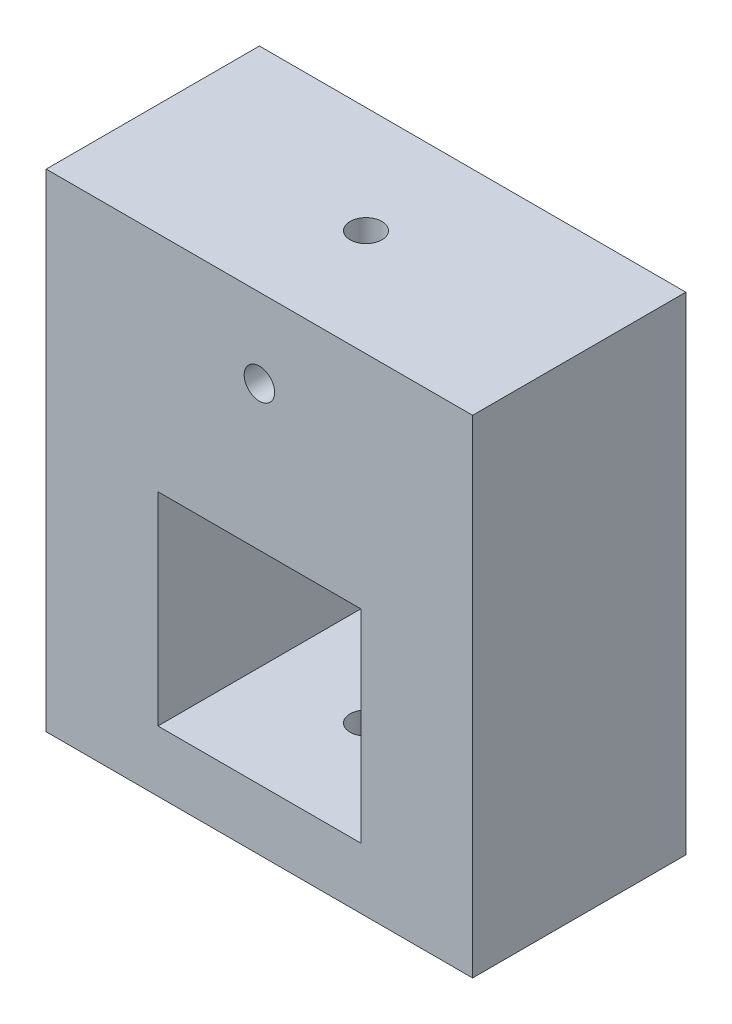
ISO-10303-21;
HEADER;
FILE_DESCRIPTION(('STEP AP214'),'2;1');
FILE_NAME('part.step','',(''),(''),'','','');
FILE_SCHEMA(('AUTOMOTIVE_DESIGN { 1 0 10303 214 1 1 1 1 }'));
ENDSEC;
DATA;
#1=APPLICATION_CONTEXT('core data for automotive mechanical design processes');
#2=APPLICATION_PROTOCOL_DEFINITION('international standard','automotive_design',2000,#1);
#3=PRODUCT_CONTEXT('',#1,'mechanical');
#4=PRODUCT('Part','Part','',(#3));
#5=PRODUCT_RELATED_PRODUCT_CATEGORY('part','',(#4));
#6=PRODUCT_DEFINITION_FORMATION('','',#4);
#7=PRODUCT_DEFINITION_CONTEXT('part definition',#1,'design');
#8=PRODUCT_DEFINITION('design','',#6,#7);
#9=PRODUCT_DEFINITION_SHAPE('','',#8);
#10=(LENGTH_UNIT() NAMED_UNIT(*) SI_UNIT(.MILLI.,.METRE.));
#11=(NAMED_UNIT(*) PLANE_ANGLE_UNIT() SI_UNIT($,.RADIAN.));
#12=(NAMED_UNIT(*) SI_UNIT($,.STERADIAN.) SOLID_ANGLE_UNIT());
#13=UNCERTAINTY_MEASURE_WITH_UNIT(LENGTH_MEASURE(1.E-05),#10,'distance_accuracy_value','');
#14=(GEOMETRIC_REPRESENTATION_CONTEXT(3) GLOBAL_UNCERTAINTY_ASSIGNED_CONTEXT((#13)) GLOBAL_UNIT_ASSIGNED_CONTEXT((#10,
#11,#12)) REPRESENTATION_CONTEXT('',''));
#15=CARTESIAN_POINT('',(0.,0.,0.));
#16=DIRECTION('',(0.,0.,1.));
#17=DIRECTION('',(1.,0.,0.));
#18=AXIS2_PLACEMENT_3D('',#15,#16,#17);
#19=CARTESIAN_POINT('',(0.,101.6,0.));
#20=DIRECTION('',(0.,-1.,0.));
#21=DIRECTION('',(0.,0.,-1.));
#22=AXIS2_PLACEMENT_3D('',#19,#20,#21);
#23=CYLINDRICAL_SURFACE('',#22,3.32310507927727);
#24=CARTESIAN_POINT('',(0.,88.265,-3.32310507927725));
#25=CARTESIAN_POINT('',(-0.0719628894680428,88.2649995929097,-3.3231046721935));
#26=CARTESIAN_POINT('',(-0.143948059310517,88.2625478466654,-3.32076197001386));
#27=CARTESIAN_POINT('',(-0.287320125691089,88.2527901679541,-3.31144107507179));
#28=CARTESIAN_POINT('',(-0.358706582399328,88.2454809377386,-3.30445973313507));
#29=CARTESIAN_POINT('',(-0.500404983924367,88.2261347004359,-3.28599069256951));
#30=CARTESIAN_POINT('',(-0.570714314526168,88.2140876507875,-3.27449342177729));
#31=CARTESIAN_POINT('',(-0.709583781087099,88.1855053259842,-3.24723535736837));
#32=CARTESIAN_POINT('',(-0.778143063548392,88.1689679049612,-3.23147252532856));
#33=CARTESIAN_POINT('',(-0.979445856888055,88.1133326692021,-3.17849219988499));
#34=CARTESIAN_POINT('',(-1.10901819741605,88.0680401974484,-3.13541841190377));
#35=CARTESIAN_POINT('',(-1.35688704613617,87.9636101088531,-3.03640634175811));
#36=CARTESIAN_POINT('',(-1.4751854587132,87.9044748361826,-2.98047023775558));
#37=CARTESIAN_POINT('',(-1.74548646016447,87.7484180465737,-2.8334855720088));
#38=CARTESIAN_POINT('',(-1.89154612476528,87.6459239361564,-2.73742277708625));
#39=CARTESIAN_POINT('',(-2.15946798730409,87.4240439082945,-2.53148553149346));
#40=CARTESIAN_POINT('',(-2.28125328075335,87.3046062948107,-2.42156893062753));
#41=CARTESIAN_POINT('',(-2.46390433434089,87.0954897669931,-2.23229787553111));
#42=CARTESIAN_POINT('',(-2.5314294622677,87.009440653002,-2.15520780705837));
#43=CARTESIAN_POINT('',(-2.65659697467479,86.8321002403306,-1.99888549427369));
#44=CARTESIAN_POINT('',(-2.71423238513474,86.7408053024725,-1.91965178352128));
#45=CARTESIAN_POINT('',(-2.81975894618337,86.5532659809747,-1.76097987978065));
#46=CARTESIAN_POINT('',(-2.86766665087914,86.4570303608901,-1.6815422711334));
#47=CARTESIAN_POINT('',(-2.9539914147846,86.2588713139742,-1.52476510133464));
#48=CARTESIAN_POINT('',(-2.99241916138363,86.1569544524383,-1.44742326588901));
#49=CARTESIAN_POINT('',(-3.04913815456089,85.9783704528915,-1.32247198181113));
#50=CARTESIAN_POINT('',(-3.0699717485766,85.9037417014365,-1.2731125240853));
#51=CARTESIAN_POINT('',(-3.10675253142721,85.7495461701801,-1.18049435164098));
#52=CARTESIAN_POINT('',(-3.1227044831238,85.6699842952271,-1.13722971279422));
#53=CARTESIAN_POINT('',(-3.14495562109349,85.5296220077705,-1.07380563314068));
#54=CARTESIAN_POINT('',(-3.15271504122451,85.4704648538344,-1.05061990503111));
#55=CARTESIAN_POINT('',(-3.1649882469882,85.3491641701777,-1.01305027303107));
#56=CARTESIAN_POINT('',(-3.16951333276403,85.2870318552562,-0.998635750742641));
#57=CARTESIAN_POINT('',(-3.17487016728978,85.1599851443049,-0.981492533985096));
#58=CARTESIAN_POINT('',(-3.17564861209525,85.0950437854406,-0.978932514299723));
#59=CARTESIAN_POINT('',(-3.17323716638988,84.9660049020759,-0.986712118036445));
#60=CARTESIAN_POINT('',(-3.17004226848449,84.9019085454446,-0.99706801875974));
#61=CARTESIAN_POINT('',(-3.15892206039322,84.7614129770987,-1.03180492970362));
#62=CARTESIAN_POINT('',(-3.15003250196133,84.6858293405592,-1.05899219410396));
#63=CARTESIAN_POINT('',(-3.12778164273254,84.5394194202577,-1.12301584318632));
#64=CARTESIAN_POINT('',(-3.11439714521725,84.4686201516173,-1.15990206174058));
#65=CARTESIAN_POINT('',(-3.07770634176028,84.3038509484906,-1.25468563239307));
#66=CARTESIAN_POINT('',(-3.05256950083859,84.2117881826296,-1.31512394998334));
#67=CARTESIAN_POINT('',(-2.99538141279573,84.0330659094562,-1.44066983774483));
#68=CARTESIAN_POINT('',(-2.96331749829891,83.9464166810568,-1.50578581425682));
#69=CARTESIAN_POINT('',(-2.89233190024716,83.7771895957228,-1.63801437676553));
#70=CARTESIAN_POINT('',(-2.85339353334248,83.6946222836129,-1.70513148218597));
#71=CARTESIAN_POINT('',(-2.76868848648852,83.5333116975272,-1.83948460802266));
#72=CARTESIAN_POINT('',(-2.72292718847824,83.4545654737851,-1.90672049380565));
#73=CARTESIAN_POINT('',(-2.62220880369955,83.2973101394481,-2.04317111270075));
#74=CARTESIAN_POINT('',(-2.56693548497014,83.2189642074982,-2.11234258539904));
#75=CARTESIAN_POINT('',(-2.44852496134113,83.0664682272024,-2.24853645453567));
#76=CARTESIAN_POINT('',(-2.38538511227061,82.99231960194,-2.31555811879021));
#77=CARTESIAN_POINT('',(-2.18413258360923,82.7772925094163,-2.51147255246812));
#78=CARTESIAN_POINT('',(-2.03375554028129,82.6431451222397,-2.63582315215429));
#79=CARTESIAN_POINT('',(-1.75209618579467,82.4384216520607,-2.82708877028671));
#80=CARTESIAN_POINT('',(-1.62960045613412,82.3610984662687,-2.899790192172));
#81=CARTESIAN_POINT('',(-1.36932822762399,82.2216766057466,-3.03135947595703));
#82=CARTESIAN_POINT('',(-1.23156767353863,82.1595622584684,-3.09024157590399));
#83=CARTESIAN_POINT('',(-0.964365114052177,82.0621744831952,-3.18275636379304));
#84=CARTESIAN_POINT('',(-0.836736651144741,82.0242821398419,-3.21884269574408));
#85=CARTESIAN_POINT('',(-0.574492110422607,81.9645197991814,-3.27581225321721));
#86=CARTESIAN_POINT('',(-0.43988042230729,81.9426398639908,-3.29670490843754));
#87=CARTESIAN_POINT('',(-0.166877373579198,81.9164151783968,-3.32175069901273));
#88=CARTESIAN_POINT('',(-0.0284739370676149,81.9121351882427,-3.32584201256186));
#89=CARTESIAN_POINT('',(0.247134832522216,81.9216306990446,-3.31677019085915));
#90=CARTESIAN_POINT('',(0.384340116160246,81.9354069415567,-3.30360634695081));
#91=CARTESIAN_POINT('',(0.645455680768369,81.9786469829875,-3.26234289740734));
#92=CARTESIAN_POINT('',(0.769675134528781,82.0071520803762,-3.2351562110502));
#93=CARTESIAN_POINT('',(1.01064402563281,82.0775248185352,-3.16816895479981));
#94=CARTESIAN_POINT('',(1.1273907257246,82.1193973225072,-3.12836379421114));
#95=CARTESIAN_POINT('',(1.39291452502013,82.2320052532176,-3.02160546143124));
#96=CARTESIAN_POINT('',(1.53774407146582,82.307694360523,-2.9500494520659));
#97=CARTESIAN_POINT('',(1.80859987613172,82.4755952875136,-2.79225776273733));
#98=CARTESIAN_POINT('',(1.93458706477745,82.5678405889483,-2.70599235381182));
#99=CARTESIAN_POINT('',(2.20922415491393,82.8002672695885,-2.49051521227594));
#100=CARTESIAN_POINT('',(2.34994365477591,82.9458148179591,-2.35695613457068));
#101=CARTESIAN_POINT('',(2.53605940239768,83.1771883224825,-2.14944303858524));
#102=CARTESIAN_POINT('',(2.59398835425322,83.2565846720653,-2.07899313221417));
#103=CARTESIAN_POINT('',(2.7018048384047,83.4195496799966,-1.93681113895068));
#104=CARTESIAN_POINT('',(2.75169525273491,83.5031168288627,-1.86507952187899));
#105=CARTESIAN_POINT('',(2.85946112791458,83.7039085527315,-1.69692146100411));
#106=CARTESIAN_POINT('',(2.91419413165943,83.82283540787,-1.6004748458269));
#107=CARTESIAN_POINT('',(2.98572104470139,84.00813087628,-1.45989061647062));
#108=CARTESIAN_POINT('',(3.00778611389592,84.070987157153,-1.41374989864057));
#109=CARTESIAN_POINT('',(3.04833868364338,84.1996013037859,-1.32403422858988));
#110=CARTESIAN_POINT('',(3.0668285087288,84.2653572498675,-1.28045762216021));
#111=CARTESIAN_POINT('',(3.09840320589347,84.3939637903436,-1.20188931423008));
#112=CARTESIAN_POINT('',(3.11184063275491,84.4564650803155,-1.16647479350597));
#113=CARTESIAN_POINT('',(3.13531039407728,84.5852888761238,-1.10183151896138));
#114=CARTESIAN_POINT('',(3.14534510891551,84.6516086725624,-1.07259844630167));
#115=CARTESIAN_POINT('',(3.15982647303946,84.7750669653401,-1.02905358981892));
#116=CARTESIAN_POINT('',(3.16498244433069,84.8314617684853,-1.01294118334985));
#117=CARTESIAN_POINT('',(3.17225996882404,84.9462215366478,-0.989923766705363));
#118=CARTESIAN_POINT('',(3.17439104541016,85.0045797235832,-0.982989864187884));
#119=CARTESIAN_POINT('',(3.17538379562064,85.1219458093254,-0.979780873097124));
#120=CARTESIAN_POINT('',(3.17422826815657,85.1809555103722,-0.983561862641266));
#121=CARTESIAN_POINT('',(3.16875917476272,85.2973905998246,-1.00103374556159));
#122=CARTESIAN_POINT('',(3.16443720419124,85.3548113489394,-1.01475101154825));
#123=CARTESIAN_POINT('',(3.14989233108371,85.4980438149906,-1.05923880867261));
#124=CARTESIAN_POINT('',(3.13772673770057,85.5819589925022,-1.0952468944224));
#125=CARTESIAN_POINT('',(3.10801817688304,85.7439776672191,-1.17692829422889));
#126=CARTESIAN_POINT('',(3.09045079877255,85.8220527398335,-1.22264518617822));
#127=CARTESIAN_POINT('',(3.04742103247679,85.9855760526906,-1.3266108366896));
#128=CARTESIAN_POINT('',(3.02115353433142,86.0702673431208,-1.3857012667116));
#129=CARTESIAN_POINT('',(2.96253775868488,86.2352769397539,-1.50697016813464));
#130=CARTESIAN_POINT('',(2.93018334336836,86.3155907254908,-1.56915170951791));
#131=CARTESIAN_POINT('',(2.85940368149672,86.4727003000036,-1.69470974106039));
#132=CARTESIAN_POINT('',(2.82097114245325,86.5494917180381,-1.7580875850484));
#133=CARTESIAN_POINT('',(2.7380037262583,86.6997587462441,-1.88470089047189));
#134=CARTESIAN_POINT('',(2.69347102483194,86.7732355262714,-1.94793639453826));
#135=CARTESIAN_POINT('',(2.58955501420356,86.9298844209112,-2.08467359970878));
#136=CARTESIAN_POINT('',(2.52894121121664,87.0124245324518,-2.1579769845902));
#137=CARTESIAN_POINT('',(2.39873742263109,87.1726326827643,-2.30185404160141));
#138=CARTESIAN_POINT('',(2.32914409836394,87.2502988933298,-2.37242668566601));
#139=CARTESIAN_POINT('',(2.10675011584008,87.4746153492537,-2.57781725208352));
#140=CARTESIAN_POINT('',(1.9398514416458,87.6133322688888,-2.70697461102003));
#141=CARTESIAN_POINT('',(1.63850596912244,87.8130853422638,-2.89429268161168));
#142=CARTESIAN_POINT('',(1.51553003794063,87.8836960318788,-2.960866618203));
#143=CARTESIAN_POINT('',(1.25563203191797,88.0097233390715,-3.08005801311208));
#144=CARTESIAN_POINT('',(1.11872119350128,88.0651520675741,-3.13268659479311));
#145=CARTESIAN_POINT('',(0.852714631192001,88.1511003609329,-3.21443464060099));
#146=CARTESIAN_POINT('',(0.725062442758907,88.1839736244598,-3.24576975534904));
#147=CARTESIAN_POINT('',(0.464084447097616,88.233688613161,-3.29319344042971));
#148=CARTESIAN_POINT('',(0.330774716351617,88.2505729528498,-3.30932253812058));
#149=CARTESIAN_POINT('',(0.163954930341117,88.2609350666816,-3.31922155029249));
#150=CARTESIAN_POINT('',(0.131205489399635,88.2624578234865,-3.3206762909909));
#151=CARTESIAN_POINT('',(0.065638915496142,88.2644904415946,-3.32261820430773));
#152=CARTESIAN_POINT('',(0.032821775139713,88.265000185671,-3.32310526494533));
#153=CARTESIAN_POINT('',(0.,88.265,-3.32310507927725));
#154=B_SPLINE_CURVE_WITH_KNOTS('',3,(#24,#25,#26,#27,#28,#29,#30,#31,#32,#33,#34,#35,#36,#37,
#38,#39,#40,#41,#42,#43,#44,#45,#46,#47,#48,#49,#50,#51,#52,#53,#54,#55,#56,#57,#58,#59,#60,#61,
#62,#63,#64,#65,#66,#67,#68,#69,#70,#71,#72,#73,#74,#75,#76,#77,#78,#79,#80,#81,#82,#83,#84,#85,
#86,#87,#88,#89,#90,#91,#92,#93,#94,#95,#96,#97,#98,#99,#100,#101,#102,#103,#104,#105,#106,#107,
#108,#109,#110,#111,#112,#113,#114,#115,#116,#117,#118,#119,#120,#121,#122,#123,#124,#125,#126,
#127,#128,#129,#130,#131,#132,#133,#134,#135,#136,#137,#138,#139,#140,#141,#142,#143,#144,#145,
#146,#147,#148,#149,#150,#151,#152,#153),.UNSPECIFIED.,.T.,.F.,(4,2,2,2,2,2,2,2,2,2,2,2,2,2,2,2,
2,2,2,2,2,2,2,2,2,2,2,2,2,2,2,2,2,2,2,2,2,2,2,2,2,2,2,2,2,2,2,2,2,2,2,2,2,2,2,2,2,2,2,2,2,2,2,2,
4),(0.,0.215847880822609,0.431842450787801,0.648297344778737,0.864855861294421,1.29434103632481,
1.72375353391482,2.32837864105842,2.93488985561014,3.33588723723923,3.73716624192263,
4.13775653945137,4.53789313953443,4.81323612427386,5.08830960284973,5.27981694740716,
5.47065188736831,5.66419399308128,5.85798025707112,6.0990649805467,6.34141347659721,
6.67958664267783,7.01838353314657,7.35801423188328,7.6973784329951,8.05168852590495,
8.40611803573895,9.11196556334087,9.59659199088466,10.080716894104,10.4927873404274,
10.9046018234364,11.3179302585869,11.731275669361,12.1205877501027,12.5100416283542,
13.04226681872,13.5755807160888,14.2990024641954,14.6615281558662,15.0239235816038,
15.510783064201,15.7537752793454,15.9966089719713,16.2155840368477,16.4344055995135,
16.6103969280263,16.785832938376,16.9621888144852,17.1390144930182,17.4138105755288,
17.6898671806693,18.0091042523193,18.3286649728009,18.6486120499372,18.9684453082815,
19.3457819849223,19.723259365282,20.4749145389371,20.9433238630485,21.4113584330513,
21.8161541635193,22.2198679493012,22.318303281424,22.4167500039098),.UNSPECIFIED.);
#155=CARTESIAN_POINT('',(0.,88.265,-3.32310507927725));
#156=VERTEX_POINT('',#155);
#157=EDGE_CURVE('E124',#156,#156,#154,.T.);
#158=ORIENTED_EDGE('',*,*,#157,.F.);
#159=EDGE_LOOP('',(#158));
#160=FACE_BOUND('',#159,.T.);
#161=CARTESIAN_POINT('',(3.175,85.09,0.981021084339436));
#162=CARTESIAN_POINT('',(3.17499610366501,85.0274184455131,0.981041466729162));
#163=CARTESIAN_POINT('',(3.17312109173982,84.9647503301603,0.987162455387204));
#164=CARTESIAN_POINT('',(3.16587493236928,84.8415790919042,1.01014542392646));
#165=CARTESIAN_POINT('',(3.16049052958767,84.7810850986972,1.0270481222691));
#166=CARTESIAN_POINT('',(3.14247911818375,84.6266115572304,1.0812292367519));
#167=CARTESIAN_POINT('',(3.1274309535807,84.535162264031,1.12464266194966));
#168=CARTESIAN_POINT('',(3.09099764543301,84.3588960192044,1.22125921587473));
#169=CARTESIAN_POINT('',(3.06958280573494,84.2741125558534,1.27450776781298));
#170=CARTESIAN_POINT('',(3.01671385043634,84.0948884767294,1.39555174692051));
#171=CARTESIAN_POINT('',(2.98415380304849,84.0013937783027,1.46425394740129));
#172=CARTESIAN_POINT('',(2.91131723226553,83.8193857460912,1.60421974721386));
#173=CARTESIAN_POINT('',(2.87103279693806,83.7308776412893,1.67548591142738));
#174=CARTESIAN_POINT('',(2.78271579030379,83.5581663028203,1.81839965952745));
#175=CARTESIAN_POINT('',(2.73468520585457,83.4739619725256,1.89004714106269));
#176=CARTESIAN_POINT('',(2.6307248702486,83.3097349301321,2.03225883663259));
#177=CARTESIAN_POINT('',(2.57479920130537,83.2297100861097,2.10282358972557));
#178=CARTESIAN_POINT('',(2.40946595169551,83.0151733905228,2.29422206767511));
#179=CARTESIAN_POINT('',(2.29152824260496,82.8850750168029,2.41284032266017));
#180=CARTESIAN_POINT('',(2.02925541185275,82.6416112052632,2.6372030764406));
#181=CARTESIAN_POINT('',(1.88497518094307,82.5282118426909,2.74297359715009));
#182=CARTESIAN_POINT('',(1.61011631737487,82.349982923167,2.91022562224129));
#183=CARTESIAN_POINT('',(1.48547949408133,82.2801502705414,2.9761143422974));
#184=CARTESIAN_POINT('',(1.22218164682757,82.1560642847065,3.09353809603215));
#185=CARTESIAN_POINT('',(1.08352729673714,82.1018035843493,3.14507991693341));
#186=CARTESIAN_POINT('',(0.866478394160479,82.0345639733603,3.20905675211074));
#187=CARTESIAN_POINT('',(0.792188461068423,82.0144392631244,3.22822687112355));
#188=CARTESIAN_POINT('',(0.64129194921638,81.9794768442789,3.2615530479825));
#189=CARTESIAN_POINT('',(0.564686655159188,81.9646362600885,3.27571183293321));
#190=CARTESIAN_POINT('',(0.409847709606608,81.940590214503,3.29866207427012));
#191=CARTESIAN_POINT('',(0.331615125790823,81.9313811717308,3.30745694182861));
#192=CARTESIAN_POINT('',(0.174286102540626,81.9188033536016,3.31947095991378));
#193=CARTESIAN_POINT('',(0.0951898076032476,81.9154336159603,3.32269102913556));
#194=CARTESIAN_POINT('',(-0.11872728986797,81.9143711891861,3.32370545611252));
#195=CARTESIAN_POINT('',(-0.253681295084251,81.9223256179737,3.31610294538068));
#196=CARTESIAN_POINT('',(-0.519563562219013,81.9549295515688,3.28497286618092));
#197=CARTESIAN_POINT('',(-0.650491559773249,81.9795801502787,3.26144425426418));
#198=CARTESIAN_POINT('',(-0.90247208910259,82.0432443086596,3.20078601666008));
#199=CARTESIAN_POINT('',(-1.02367066962201,82.0819577176195,3.16394069461286));
#200=CARTESIAN_POINT('',(-1.25700428849861,82.1717431205587,3.07870547709206));
#201=CARTESIAN_POINT('',(-1.36913660787043,82.2228188037974,3.03031213541707));
#202=CARTESIAN_POINT('',(-1.63310535874364,82.3614507130902,2.89942062377128));
#203=CARTESIAN_POINT('',(-1.77916234251083,82.4549272260097,2.81152689214481));
#204=CARTESIAN_POINT('',(-2.04890067485876,82.6586702773219,2.62152414705141));
#205=CARTESIAN_POINT('',(-2.17251531808191,82.7689851316949,2.51937430173294));
#206=CARTESIAN_POINT('',(-2.36091343874232,82.964292960272,2.34094425712248));
#207=CARTESIAN_POINT('',(-2.43173574253979,83.0458109166525,2.26709198737924));
#208=CARTESIAN_POINT('',(-2.56376470506189,83.2140519315643,2.11663756021942));
#209=CARTESIAN_POINT('',(-2.62496593232272,83.3007778923071,2.04003387928825));
#210=CARTESIAN_POINT('',(-2.73793726773254,83.4789619306025,1.88569901446627));
#211=CARTESIAN_POINT('',(-2.78971880969876,83.5704140957991,1.80796932282901));
#212=CARTESIAN_POINT('',(-2.88415399851762,83.758328754178,1.653139874138));
#213=CARTESIAN_POINT('',(-2.92681426888191,83.854787548051,1.57603969935359));
#214=CARTESIAN_POINT('',(-2.99498461151395,84.0327660236241,1.44136364119196));
#215=CARTESIAN_POINT('',(-3.02221322437906,84.1131181569203,1.38311349204602));
#216=CARTESIAN_POINT('',(-3.07086908305375,84.2789086914821,1.27140293748809));
#217=CARTESIAN_POINT('',(-3.09229697625589,84.3643465238563,1.21794199801964));
#218=CARTESIAN_POINT('',(-3.12357859284896,84.5171741098741,1.13475899177511));
#219=CARTESIAN_POINT('',(-3.13499252723584,84.5828788467959,1.10258979632773));
#220=CARTESIAN_POINT('',(-3.15392575101443,84.7184818095957,1.04720469182953));
#221=CARTESIAN_POINT('',(-3.16145816067098,84.7883650054002,1.02395868964372));
#222=CARTESIAN_POINT('',(-3.17057545725088,84.9139603113528,0.995316322490808));
#223=CARTESIAN_POINT('',(-3.17317235350898,84.9688859999949,0.986922120852154));
#224=CARTESIAN_POINT('',(-3.17546149759076,85.0794012464068,0.979536036714584));
#225=CARTESIAN_POINT('',(-3.17515744421064,85.1349898685683,0.98053218122846));
#226=CARTESIAN_POINT('',(-3.17169608330742,85.2448857707028,0.991664518265846));
#227=CARTESIAN_POINT('',(-3.16854926667424,85.2991970091777,1.00176710421729));
#228=CARTESIAN_POINT('',(-3.15971502250605,85.4057516926927,1.0292869403832));
#229=CARTESIAN_POINT('',(-3.15402194896195,85.4579902600387,1.04672044082584));
#230=CARTESIAN_POINT('',(-3.14030513638389,85.5610256278119,1.08718585167168));
#231=CARTESIAN_POINT('',(-3.13223916582945,85.6117761699389,1.11031784788531));
#232=CARTESIAN_POINT('',(-3.11407379355347,85.7110599575999,1.16029526768534));
#233=CARTESIAN_POINT('',(-3.10397213226017,85.7595906650668,1.18714480720709));
#234=CARTESIAN_POINT('',(-3.07079028185316,85.90272730106,1.2715753230475));
#235=CARTESIAN_POINT('',(-3.04489061608994,85.9944741412712,1.33285607901513));
#236=CARTESIAN_POINT('',(-2.98172869276856,86.1861656181842,1.46930302571914));
#237=CARTESIAN_POINT('',(-2.94333471716557,86.2852195478962,1.54515983489033));
#238=CARTESIAN_POINT('',(-2.85748464329949,86.4779944801759,1.69869655234852));
#239=CARTESIAN_POINT('',(-2.81001963324304,86.5717101196465,1.77637818704579));
#240=CARTESIAN_POINT('',(-2.70594592417685,86.7541798970315,1.93121313789563));
#241=CARTESIAN_POINT('',(-2.6493474564306,86.842939438713,2.00836694566573));
#242=CARTESIAN_POINT('',(-2.52673484460937,87.0154667418938,2.16059953090805));
#243=CARTESIAN_POINT('',(-2.46072659141422,87.0992375803379,2.23567957179307));
#244=CARTESIAN_POINT('',(-2.28238923977563,87.3031366965141,2.42025502505344));
#245=CARTESIAN_POINT('',(-2.1637014712957,87.4197950842927,2.52758200815287));
#246=CARTESIAN_POINT('',(-1.90301665475281,87.6371203403731,2.72921486951059));
#247=CARTESIAN_POINT('',(-1.76106362415867,87.737816714092,2.82354472940192));
#248=CARTESIAN_POINT('',(-1.48880569890533,87.89768122878,2.97404243017377));
#249=CARTESIAN_POINT('',(-1.36311240610111,87.9610920602588,3.03401743215556));
#250=CARTESIAN_POINT('',(-1.099011999611,88.07215007636,3.13931659318248));
#251=CARTESIAN_POINT('',(-0.96061156692496,88.1198054847141,3.18464839513675));
#252=CARTESIAN_POINT('',(-0.74525604674085,88.1772060616785,3.23932260177805));
#253=CARTESIAN_POINT('',(-0.671797700847278,88.1940399563081,3.25537226023776));
#254=CARTESIAN_POINT('',(-0.523007768828862,88.2225408298375,3.2825593220172));
#255=CARTESIAN_POINT('',(-0.447677167524226,88.2342104668685,3.29369925244523));
#256=CARTESIAN_POINT('',(-0.29581910109517,88.2521128130504,3.31079336886502));
#257=CARTESIAN_POINT('',(-0.219292175194063,88.25834790368,3.31674982631038));
#258=CARTESIAN_POINT('',(-0.0657860685259203,88.2652496869684,3.32334353626064));
#259=CARTESIAN_POINT('',(0.0111930507465134,88.2659171200079,3.32398149601339));
#260=CARTESIAN_POINT('',(0.220756616565323,88.2600867685567,3.31841057994134));
#261=CARTESIAN_POINT('',(0.353120283755224,88.2480328739387,3.30689237937036));
#262=CARTESIAN_POINT('',(0.613060317507489,88.2080323789504,3.26871440106773));
#263=CARTESIAN_POINT('',(0.740636107882734,88.180083872272,3.24205280712525));
#264=CARTESIAN_POINT('',(0.988705327571889,88.1098980093892,3.17522761847547));
#265=CARTESIAN_POINT('',(1.10916238188331,88.0675936563589,3.1350007219256));
#266=CARTESIAN_POINT('',(1.3404660003651,87.9708891518184,3.04330246596848));
#267=CARTESIAN_POINT('',(1.45130940434866,87.9164850436815,2.99182742850929));
#268=CARTESIAN_POINT('',(1.71478479752458,87.7682343604507,2.8520961900125));
#269=CARTESIAN_POINT('',(1.86096773893438,87.6681888286143,2.75824076928867));
#270=CARTESIAN_POINT('',(2.1296187691738,87.451216008968,2.55658090407787));
#271=CARTESIAN_POINT('',(2.25201137322244,87.3342369768048,2.44873381350019));
#272=CARTESIAN_POINT('',(2.43646117014261,87.1287325335308,2.26222398130652));
#273=CARTESIAN_POINT('',(2.50500101503562,87.0437897578578,2.18587608440341));
#274=CARTESIAN_POINT('',(2.63224159934485,86.8686676551712,2.03085817187462));
#275=CARTESIAN_POINT('',(2.69093584389947,86.7784849239009,1.95218666335223));
#276=CARTESIAN_POINT('',(2.79865070876136,86.593213603009,1.79435160145549));
#277=CARTESIAN_POINT('',(2.84768462130099,86.498131984706,1.7151888809844));
#278=CARTESIAN_POINT('',(2.93633752871875,86.3024762887977,1.55852419996875));
#279=CARTESIAN_POINT('',(2.97596587580426,86.201907790392,1.48102066003259));
#280=CARTESIAN_POINT('',(3.03595696993349,86.0226546827152,1.35260114848989));
#281=CARTESIAN_POINT('',(3.05860774141651,85.945721037851,1.3003139492806));
#282=CARTESIAN_POINT('',(3.09868979611855,85.7867566660301,1.20164459685696));
#283=CARTESIAN_POINT('',(3.11612578900573,85.7047306195773,1.15525713725848));
#284=CARTESIAN_POINT('',(3.14063216351755,85.5597838677183,1.08644908587659));
#285=CARTESIAN_POINT('',(3.14924264290538,85.4985892453207,1.06102319901727));
#286=CARTESIAN_POINT('',(3.16300140871451,85.3728407044569,1.01928552916961));
#287=CARTESIAN_POINT('',(3.16816422528045,85.3083021355373,1.00293554571353));
#288=CARTESIAN_POINT('',(3.17254038217133,85.2174993966743,0.988953765481236));
#289=CARTESIAN_POINT('',(3.17345998047603,85.1921028355857,0.98599412997144));
#290=CARTESIAN_POINT('',(3.17469060965112,85.1411423451096,0.982023547182386));
#291=CARTESIAN_POINT('',(3.17500159251438,85.1155784026788,0.981012753626397));
#292=CARTESIAN_POINT('',(3.175,85.09,0.981021084339436));
#293=B_SPLINE_CURVE_WITH_KNOTS('',3,(#161,#162,#163,#164,#165,#166,#167,#168,#169,#170,#171,
#172,#173,#174,#175,#176,#177,#178,#179,#180,#181,#182,#183,#184,#185,#186,#187,#188,#189,#190,
#191,#192,#193,#194,#195,#196,#197,#198,#199,#200,#201,#202,#203,#204,#205,#206,#207,#208,#209,
#210,#211,#212,#213,#214,#215,#216,#217,#218,#219,#220,#221,#222,#223,#224,#225,#226,#227,#228,
#229,#230,#231,#232,#233,#234,#235,#236,#237,#238,#239,#240,#241,#242,#243,#244,#245,#246,#247,
#248,#249,#250,#251,#252,#253,#254,#255,#256,#257,#258,#259,#260,#261,#262,#263,#264,#265,#266,
#267,#268,#269,#270,#271,#272,#273,#274,#275,#276,#277,#278,#279,#280,#281,#282,#283,#284,#285,
#286,#287,#288,#289,#290,#291,#292),.UNSPECIFIED.,.T.,.F.,(4,2,2,2,2,2,2,2,2,2,2,2,2,2,2,2,2,2,
2,2,2,2,2,2,2,2,2,2,2,2,2,2,2,2,2,2,2,2,2,2,2,2,2,2,2,2,2,2,2,2,2,2,2,2,2,2,2,2,2,2,2,2,2,2,2,
4),(0.,0.187627698259957,0.37596822531018,0.681249317334504,0.987977292374586,1.34898183476024,
1.71035814127069,2.07164190313175,2.43273954005142,3.06611176331181,3.69817896645797,
4.16850138252687,4.63860091912077,4.87624903893333,5.11376763408384,5.3511350218373,
5.58846328906935,5.99242358211927,6.39641034446623,6.79223761399937,7.18818315577522,
7.7682191483111,8.34995192130603,8.74196332442064,9.13419524425319,9.52594784060066,
9.91741498800821,10.2259002069464,10.5343509830125,10.7560214866089,10.9769377055333,
11.1430370172287,11.3089245757422,11.4742024350562,11.6398486085872,11.8086423787278,
11.977624548543,12.3169166054519,12.7080736839361,13.0996170468962,13.4907248109156,
13.8815887933386,14.4735585122692,15.0644208970101,15.5218194292982,15.9789788386249,
16.2098405809723,16.4405833562575,16.6712249665868,16.9018359059645,17.2999376968633,
17.6980872438687,18.0981210561981,18.4982858726454,19.0963849044313,19.6963517401228,
20.0954905083936,20.4948915503967,20.8937391342357,21.2921884559622,21.5791427845688,
21.8658371655602,22.0658106976095,22.2649360325724,22.3416173861382,22.4183047880274),.UNSPECIFIED.);
#294=CARTESIAN_POINT('',(3.175,85.09,0.981021084339436));
#295=VERTEX_POINT('',#294);
#296=EDGE_CURVE('E220',#295,#295,#293,.T.);
#297=ORIENTED_EDGE('',*,*,#296,.F.);
#298=EDGE_LOOP('',(#297));
#299=FACE_BOUND('',#298,.T.);
#300=CARTESIAN_POINT('',(0.,55.,0.));
#301=DIRECTION('',(0.,1.,0.));
#302=DIRECTION('',(-1.,0.,0.));
#303=AXIS2_PLACEMENT_3D('',#300,#301,#302);
#304=CIRCLE('',#303,3.32310507927727);
#305=CARTESIAN_POINT('',(-3.32310507927726,55.,0.));
#306=VERTEX_POINT('',#305);
#307=EDGE_CURVE('E37',#306,#306,#304,.T.);
#308=ORIENTED_EDGE('',*,*,#307,.F.);
#309=EDGE_LOOP('',(#308));
#310=FACE_BOUND('',#309,.T.);
#311=CARTESIAN_POINT('',(0.,101.6,0.));
#312=DIRECTION('',(0.,1.,0.));
#313=DIRECTION('',(0.,0.,1.));
#314=AXIS2_PLACEMENT_3D('',#311,#312,#313);
#315=CIRCLE('',#314,3.32310507927727);
#316=CARTESIAN_POINT('',(0.,101.6,3.32310507927729));
#317=VERTEX_POINT('',#316);
#318=EDGE_CURVE('E144',#317,#317,#315,.T.);
#319=ORIENTED_EDGE('',*,*,#318,.T.);
#320=EDGE_LOOP('',(#319));
#321=FACE_BOUND('',#320,.T.);
#322=ADVANCED_FACE('F33',(#160,#299,#310,#321),#23,.F.);
#323=CARTESIAN_POINT('',(0.,101.6,0.));
#324=DIRECTION('',(0.,-1.,0.));
#325=DIRECTION('',(0.,0.,-1.));
#326=AXIS2_PLACEMENT_3D('',#323,#324,#325);
#327=PLANE('',#326);
#328=DIRECTION('',(0.,0.,-1.));
#329=VECTOR('',#328,1.);
#330=CARTESIAN_POINT('',(44.45,101.6,22.225));
#331=LINE('',#330,#329);
#332=CARTESIAN_POINT('',(44.45,101.6,22.225));
#333=VERTEX_POINT('',#332);
#334=CARTESIAN_POINT('',(44.45,101.6,-22.225));
#335=VERTEX_POINT('',#334);
#336=EDGE_CURVE('E151',#333,#335,#331,.T.);
#337=ORIENTED_EDGE('',*,*,#336,.T.);
#338=DIRECTION('',(-1.,0.,0.));
#339=VECTOR('',#338,1.);
#340=CARTESIAN_POINT('',(-44.45,101.6,-22.225));
#341=LINE('',#340,#339);
#342=CARTESIAN_POINT('',(-44.45,101.6,-22.225));
#343=VERTEX_POINT('',#342);
#344=EDGE_CURVE('E154',#335,#343,#341,.T.);
#345=ORIENTED_EDGE('',*,*,#344,.T.);
#346=DIRECTION('',(0.,0.,1.));
#347=VECTOR('',#346,1.);
#348=CARTESIAN_POINT('',(-44.45,101.6,22.225));
#349=LINE('',#348,#347);
#350=CARTESIAN_POINT('',(-44.45,101.6,22.225));
#351=VERTEX_POINT('',#350);
#352=EDGE_CURVE('E157',#343,#351,#349,.T.);
#353=ORIENTED_EDGE('',*,*,#352,.T.);
#354=DIRECTION('',(1.,0.,0.));
#355=VECTOR('',#354,1.);
#356=CARTESIAN_POINT('',(-44.45,101.6,22.225));
#357=LINE('',#356,#355);
#358=EDGE_CURVE('E159',#351,#333,#357,.T.);
#359=ORIENTED_EDGE('',*,*,#358,.T.);
#360=EDGE_LOOP('',(#337,#345,#353,#359));
#361=FACE_BOUND('',#360,.T.);
#362=ORIENTED_EDGE('',*,*,#318,.F.);
#363=EDGE_LOOP('',(#362));
#364=FACE_BOUND('',#363,.T.);
#365=ADVANCED_FACE('F186',(#361,#364),#327,.F.);
#366=CARTESIAN_POINT('',(0.,0.,0.));
#367=DIRECTION('',(0.,-1.,0.));
#368=DIRECTION('',(0.,0.,-1.));
#369=AXIS2_PLACEMENT_3D('',#366,#367,#368);
#370=PLANE('',#369);
#371=DIRECTION('',(0.,0.,-1.));
#372=VECTOR('',#371,1.);
#373=CARTESIAN_POINT('',(44.45,0.,22.225));
#374=LINE('',#373,#372);
#375=CARTESIAN_POINT('',(44.45,0.,22.225));
#376=VERTEX_POINT('',#375);
#377=CARTESIAN_POINT('',(44.45,0.,-22.225));
#378=VERTEX_POINT('',#377);
#379=EDGE_CURVE('E147',#376,#378,#374,.T.);
#380=ORIENTED_EDGE('',*,*,#379,.F.);
#381=DIRECTION('',(1.,0.,0.));
#382=VECTOR('',#381,1.);
#383=CARTESIAN_POINT('',(-44.45,0.,22.225));
#384=LINE('',#383,#382);
#385=CARTESIAN_POINT('',(-44.45,0.,22.225));
#386=VERTEX_POINT('',#385);
#387=EDGE_CURVE('E155',#386,#376,#384,.T.);
#388=ORIENTED_EDGE('',*,*,#387,.F.);
#389=DIRECTION('',(0.,0.,1.));
#390=VECTOR('',#389,1.);
#391=CARTESIAN_POINT('',(-44.45,0.,22.225));
#392=LINE('',#391,#390);
#393=CARTESIAN_POINT('',(-44.45,0.,-22.225));
#394=VERTEX_POINT('',#393);
#395=EDGE_CURVE('E166',#394,#386,#392,.T.);
#396=ORIENTED_EDGE('',*,*,#395,.F.);
#397=DIRECTION('',(-1.,0.,0.));
#398=VECTOR('',#397,1.);
#399=CARTESIAN_POINT('',(-44.45,0.,-22.225));
#400=LINE('',#399,#398);
#401=EDGE_CURVE('E164',#378,#394,#400,.T.);
#402=ORIENTED_EDGE('',*,*,#401,.F.);
#403=EDGE_LOOP('',(#380,#388,#396,#402));
#404=FACE_BOUND('',#403,.T.);
#405=CARTESIAN_POINT('',(0.,0.,0.));
#406=DIRECTION('',(0.,1.,0.));
#407=DIRECTION('',(0.,0.,1.));
#408=AXIS2_PLACEMENT_3D('',#405,#406,#407);
#409=CIRCLE('',#408,3.32310507927727);
#410=CARTESIAN_POINT('',(0.,0.,3.32310507927729));
#411=VERTEX_POINT('',#410);
#412=EDGE_CURVE('E148',#411,#411,#409,.T.);
#413=ORIENTED_EDGE('',*,*,#412,.T.);
#414=EDGE_LOOP('',(#413));
#415=FACE_BOUND('',#414,.T.);
#416=ADVANCED_FACE('F192',(#404,#415),#370,.T.);
#417=CARTESIAN_POINT('',(44.45,101.6,22.225));
#418=DIRECTION('',(-1.,0.,0.));
#419=DIRECTION('',(0.,0.,1.));
#420=AXIS2_PLACEMENT_3D('',#417,#418,#419);
#421=PLANE('',#420);
#422=ORIENTED_EDGE('',*,*,#379,.T.);
#423=DIRECTION('',(0.,-1.,0.));
#424=VECTOR('',#423,1.);
#425=CARTESIAN_POINT('',(44.45,101.6,-22.225));
#426=LINE('',#425,#424);
#427=EDGE_CURVE('E11',#335,#378,#426,.T.);
#428=ORIENTED_EDGE('',*,*,#427,.F.);
#429=ORIENTED_EDGE('',*,*,#336,.F.);
#430=DIRECTION('',(0.,-1.,0.));
#431=VECTOR('',#430,1.);
#432=CARTESIAN_POINT('',(44.45,101.6,22.225));
#433=LINE('',#432,#431);
#434=EDGE_CURVE('E161',#333,#376,#433,.T.);
#435=ORIENTED_EDGE('',*,*,#434,.T.);
#436=EDGE_LOOP('',(#422,#428,#429,#435));
#437=FACE_BOUND('',#436,.T.);
#438=ADVANCED_FACE('F35',(#437),#421,.F.);
#439=CARTESIAN_POINT('',(-44.45,101.6,-22.225));
#440=DIRECTION('',(0.,0.,1.));
#441=DIRECTION('',(1.,0.,0.));
#442=AXIS2_PLACEMENT_3D('',#439,#440,#441);
#443=PLANE('',#442);
#444=CARTESIAN_POINT('',(0.,85.09,-22.225));
#445=DIRECTION('',(0.,0.,1.));
#446=DIRECTION('',(1.,0.,0.));
#447=AXIS2_PLACEMENT_3D('',#444,#445,#446);
#448=CIRCLE('',#447,3.175);
#449=CARTESIAN_POINT('',(3.175,85.09,-22.225));
#450=VERTEX_POINT('',#449);
#451=EDGE_CURVE('E218',#450,#450,#448,.T.);
#452=ORIENTED_EDGE('',*,*,#451,.T.);
#453=EDGE_LOOP('',(#452));
#454=FACE_BOUND('',#453,.T.);
#455=DIRECTION('',(-1.,0.,0.));
#456=VECTOR('',#455,1.);
#457=CARTESIAN_POINT('',(21.1499999999999,55.,-22.225));
#458=LINE('',#457,#456);
#459=CARTESIAN_POINT('',(21.1499999999999,55.,-22.225));
#460=VERTEX_POINT('',#459);
#461=CARTESIAN_POINT('',(-21.1500000000001,55.,-22.225));
#462=VERTEX_POINT('',#461);
#463=EDGE_CURVE('E108',#460,#462,#458,.T.);
#464=ORIENTED_EDGE('',*,*,#463,.T.);
#465=DIRECTION('',(0.,-1.,0.));
#466=VECTOR('',#465,1.);
#467=CARTESIAN_POINT('',(-21.1500000000001,55.,-22.225));
#468=LINE('',#467,#466);
#469=CARTESIAN_POINT('',(-21.1500000000001,12.7,-22.225));
#470=VERTEX_POINT('',#469);
#471=EDGE_CURVE('E102',#462,#470,#468,.T.);
#472=ORIENTED_EDGE('',*,*,#471,.T.);
#473=DIRECTION('',(1.,0.,0.));
#474=VECTOR('',#473,1.);
#475=CARTESIAN_POINT('',(21.1499999999999,12.7,-22.225));
#476=LINE('',#475,#474);
#477=CARTESIAN_POINT('',(21.1499999999999,12.7,-22.225));
#478=VERTEX_POINT('',#477);
#479=EDGE_CURVE('E111',#470,#478,#476,.T.);
#480=ORIENTED_EDGE('',*,*,#479,.T.);
#481=DIRECTION('',(0.,1.,0.));
#482=VECTOR('',#481,1.);
#483=CARTESIAN_POINT('',(21.1499999999999,55.,-22.225));
#484=LINE('',#483,#482);
#485=EDGE_CURVE('E50',#478,#460,#484,.T.);
#486=ORIENTED_EDGE('',*,*,#485,.T.);
#487=EDGE_LOOP('',(#464,#472,#480,#486));
#488=FACE_BOUND('',#487,.T.);
#489=ORIENTED_EDGE('',*,*,#401,.T.);
#490=DIRECTION('',(0.,-1.,0.));
#491=VECTOR('',#490,1.);
#492=CARTESIAN_POINT('',(-44.45,101.6,-22.225));
#493=LINE('',#492,#491);
#494=EDGE_CURVE('E42',#343,#394,#493,.T.);
#495=ORIENTED_EDGE('',*,*,#494,.F.);
#496=ORIENTED_EDGE('',*,*,#344,.F.);
#497=ORIENTED_EDGE('',*,*,#427,.T.);
#498=EDGE_LOOP('',(#489,#495,#496,#497));
#499=FACE_BOUND('',#498,.T.);
#500=ADVANCED_FACE('F115',(#454,#488,#499),#443,.F.);
#501=CARTESIAN_POINT('',(-44.45,101.6,22.225));
#502=DIRECTION('',(1.,0.,0.));
#503=DIRECTION('',(0.,0.,-1.));
#504=AXIS2_PLACEMENT_3D('',#501,#502,#503);
#505=PLANE('',#504);
#506=ORIENTED_EDGE('',*,*,#395,.T.);
#507=DIRECTION('',(0.,-1.,0.));
#508=VECTOR('',#507,1.);
#509=CARTESIAN_POINT('',(-44.45,101.6,22.225));
#510=LINE('',#509,#508);
#511=EDGE_CURVE('E171',#351,#386,#510,.T.);
#512=ORIENTED_EDGE('',*,*,#511,.F.);
#513=ORIENTED_EDGE('',*,*,#352,.F.);
#514=ORIENTED_EDGE('',*,*,#494,.T.);
#515=EDGE_LOOP('',(#506,#512,#513,#514));
#516=FACE_BOUND('',#515,.T.);
#517=ADVANCED_FACE('F206',(#516),#505,.F.);
#518=CARTESIAN_POINT('',(-44.45,101.6,22.225));
#519=DIRECTION('',(0.,0.,-1.));
#520=DIRECTION('',(-1.,0.,0.));
#521=AXIS2_PLACEMENT_3D('',#518,#519,#520);
#522=PLANE('',#521);
#523=CARTESIAN_POINT('',(0.,85.09,22.225));
#524=DIRECTION('',(0.,0.,1.));
#525=DIRECTION('',(1.,0.,0.));
#526=AXIS2_PLACEMENT_3D('',#523,#524,#525);
#527=CIRCLE('',#526,3.175);
#528=CARTESIAN_POINT('',(3.175,85.09,22.225));
#529=VERTEX_POINT('',#528);
#530=EDGE_CURVE('E221',#529,#529,#527,.T.);
#531=ORIENTED_EDGE('',*,*,#530,.F.);
#532=EDGE_LOOP('',(#531));
#533=FACE_BOUND('',#532,.T.);
#534=DIRECTION('',(1.,0.,0.));
#535=VECTOR('',#534,1.);
#536=CARTESIAN_POINT('',(21.1499999999999,12.7,22.225));
#537=LINE('',#536,#535);
#538=CARTESIAN_POINT('',(-21.1500000000001,12.7,22.225));
#539=VERTEX_POINT('',#538);
#540=CARTESIAN_POINT('',(21.1499999999999,12.7,22.225));
#541=VERTEX_POINT('',#540);
#542=EDGE_CURVE('E134',#539,#541,#537,.T.);
#543=ORIENTED_EDGE('',*,*,#542,.F.);
#544=DIRECTION('',(0.,-1.,0.));
#545=VECTOR('',#544,1.);
#546=CARTESIAN_POINT('',(-21.1500000000001,55.,22.225));
#547=LINE('',#546,#545);
#548=CARTESIAN_POINT('',(-21.1500000000001,55.,22.225));
#549=VERTEX_POINT('',#548);
#550=EDGE_CURVE('E58',#549,#539,#547,.T.);
#551=ORIENTED_EDGE('',*,*,#550,.F.);
#552=DIRECTION('',(-1.,0.,0.));
#553=VECTOR('',#552,1.);
#554=CARTESIAN_POINT('',(21.1499999999999,55.,22.225));
#555=LINE('',#554,#553);
#556=CARTESIAN_POINT('',(21.1499999999999,55.,22.225));
#557=VERTEX_POINT('',#556);
#558=EDGE_CURVE('E118',#557,#549,#555,.T.);
#559=ORIENTED_EDGE('',*,*,#558,.F.);
#560=DIRECTION('',(0.,1.,0.));
#561=VECTOR('',#560,1.);
#562=CARTESIAN_POINT('',(21.1499999999999,55.,22.225));
#563=LINE('',#562,#561);
#564=EDGE_CURVE('E121',#541,#557,#563,.T.);
#565=ORIENTED_EDGE('',*,*,#564,.F.);
#566=EDGE_LOOP('',(#543,#551,#559,#565));
#567=FACE_BOUND('',#566,.T.);
#568=ORIENTED_EDGE('',*,*,#387,.T.);
#569=ORIENTED_EDGE('',*,*,#434,.F.);
#570=ORIENTED_EDGE('',*,*,#358,.F.);
#571=ORIENTED_EDGE('',*,*,#511,.T.);
#572=EDGE_LOOP('',(#568,#569,#570,#571));
#573=FACE_BOUND('',#572,.T.);
#574=ADVANCED_FACE('F203',(#533,#567,#573),#522,.F.);
#575=CARTESIAN_POINT('',(0.,12.7,0.));
#576=DIRECTION('',(0.,-1.,0.));
#577=DIRECTION('',(0.,0.,-1.));
#578=AXIS2_PLACEMENT_3D('',#575,#576,#577);
#579=CIRCLE('',#578,3.32310507927727);
#580=CARTESIAN_POINT('',(0.,12.7,-3.32310507927725));
#581=VERTEX_POINT('',#580);
#582=EDGE_CURVE('E140',#581,#581,#579,.T.);
#583=ORIENTED_EDGE('',*,*,#582,.F.);
#584=EDGE_LOOP('',(#583));
#585=FACE_BOUND('',#584,.T.);
#586=ORIENTED_EDGE('',*,*,#412,.F.);
#587=EDGE_LOOP('',(#586));
#588=FACE_BOUND('',#587,.T.);
#589=ADVANCED_FACE('F188',(#585,#588),#23,.F.);
#590=CARTESIAN_POINT('',(-21.1500000000001,55.,-22.225));
#591=DIRECTION('',(-1.,0.,0.));
#592=DIRECTION('',(0.,-1.,0.));
#593=AXIS2_PLACEMENT_3D('',#590,#591,#592);
#594=PLANE('',#593);
#595=ORIENTED_EDGE('',*,*,#550,.T.);
#596=DIRECTION('',(0.,0.,1.));
#597=VECTOR('',#596,1.);
#598=CARTESIAN_POINT('',(-21.1500000000001,12.7,-22.225));
#599=LINE('',#598,#597);
#600=EDGE_CURVE('E98',#470,#539,#599,.T.);
#601=ORIENTED_EDGE('',*,*,#600,.F.);
#602=ORIENTED_EDGE('',*,*,#471,.F.);
#603=DIRECTION('',(0.,0.,1.));
#604=VECTOR('',#603,1.);
#605=CARTESIAN_POINT('',(-21.1500000000001,55.,-22.225));
#606=LINE('',#605,#604);
#607=EDGE_CURVE('E138',#462,#549,#606,.T.);
#608=ORIENTED_EDGE('',*,*,#607,.T.);
#609=EDGE_LOOP('',(#595,#601,#602,#608));
#610=FACE_BOUND('',#609,.T.);
#611=ADVANCED_FACE('F100',(#610),#594,.F.);
#612=CARTESIAN_POINT('',(21.1499999999999,55.,-22.225));
#613=DIRECTION('',(0.,1.,0.));
#614=DIRECTION('',(-1.,0.,0.));
#615=AXIS2_PLACEMENT_3D('',#612,#613,#614);
#616=PLANE('',#615);
#617=ORIENTED_EDGE('',*,*,#307,.T.);
#618=EDGE_LOOP('',(#617));
#619=FACE_BOUND('',#618,.T.);
#620=ORIENTED_EDGE('',*,*,#558,.T.);
#621=ORIENTED_EDGE('',*,*,#607,.F.);
#622=ORIENTED_EDGE('',*,*,#463,.F.);
#623=DIRECTION('',(0.,0.,1.));
#624=VECTOR('',#623,1.);
#625=CARTESIAN_POINT('',(21.1499999999999,55.,-22.225));
#626=LINE('',#625,#624);
#627=EDGE_CURVE('E141',#460,#557,#626,.T.);
#628=ORIENTED_EDGE('',*,*,#627,.T.);
#629=EDGE_LOOP('',(#620,#621,#622,#628));
#630=FACE_BOUND('',#629,.T.);
#631=ADVANCED_FACE('F181',(#619,#630),#616,.F.);
#632=CARTESIAN_POINT('',(21.1499999999999,55.,-22.225));
#633=DIRECTION('',(1.,0.,0.));
#634=DIRECTION('',(0.,1.,0.));
#635=AXIS2_PLACEMENT_3D('',#632,#633,#634);
#636=PLANE('',#635);
#637=ORIENTED_EDGE('',*,*,#564,.T.);
#638=ORIENTED_EDGE('',*,*,#627,.F.);
#639=ORIENTED_EDGE('',*,*,#485,.F.);
#640=DIRECTION('',(0.,0.,1.));
#641=VECTOR('',#640,1.);
#642=CARTESIAN_POINT('',(21.1499999999999,12.7,-22.225));
#643=LINE('',#642,#641);
#644=EDGE_CURVE('E107',#478,#541,#643,.T.);
#645=ORIENTED_EDGE('',*,*,#644,.T.);
#646=EDGE_LOOP('',(#637,#638,#639,#645));
#647=FACE_BOUND('',#646,.T.);
#648=ADVANCED_FACE('F237',(#647),#636,.F.);
#649=CARTESIAN_POINT('',(21.1499999999999,12.7,-22.225));
#650=DIRECTION('',(0.,-1.,0.));
#651=DIRECTION('',(0.,0.,-1.));
#652=AXIS2_PLACEMENT_3D('',#649,#650,#651);
#653=PLANE('',#652);
#654=ORIENTED_EDGE('',*,*,#582,.T.);
#655=EDGE_LOOP('',(#654));
#656=FACE_BOUND('',#655,.T.);
#657=ORIENTED_EDGE('',*,*,#542,.T.);
#658=ORIENTED_EDGE('',*,*,#644,.F.);
#659=ORIENTED_EDGE('',*,*,#479,.F.);
#660=ORIENTED_EDGE('',*,*,#600,.T.);
#661=EDGE_LOOP('',(#657,#658,#659,#660));
#662=FACE_BOUND('',#661,.T.);
#663=ADVANCED_FACE('F112',(#656,#662),#653,.F.);
#664=CARTESIAN_POINT('',(0.,85.09,-22.225));
#665=DIRECTION('',(0.,0.,1.));
#666=DIRECTION('',(1.,0.,0.));
#667=AXIS2_PLACEMENT_3D('',#664,#665,#666);
#668=CYLINDRICAL_SURFACE('',#667,3.175);
#669=ORIENTED_EDGE('',*,*,#296,.T.);
#670=EDGE_LOOP('',(#669));
#671=FACE_BOUND('',#670,.T.);
#672=ORIENTED_EDGE('',*,*,#530,.T.);
#673=EDGE_LOOP('',(#672));
#674=FACE_BOUND('',#673,.T.);
#675=ADVANCED_FACE('F228',(#671,#674),#668,.F.);
#676=ORIENTED_EDGE('',*,*,#157,.T.);
#677=EDGE_LOOP('',(#676));
#678=FACE_BOUND('',#677,.T.);
#679=ORIENTED_EDGE('',*,*,#451,.F.);
#680=EDGE_LOOP('',(#679));
#681=FACE_BOUND('',#680,.T.);
#682=ADVANCED_FACE('F232',(#678,#681),#668,.F.);
#683=CLOSED_SHELL('',(#322,#365,#416,#438,#500,#517,#574,#589,#611,#631,#648,#663,#675,#682));
#684=MANIFOLD_SOLID_BREP('B2',#683);
#685=ADVANCED_BREP_SHAPE_REPRESENTATION('',(#18,#684),#14);
#686=SHAPE_DEFINITION_REPRESENTATION(#9,#685);
ENDSEC;
END-ISO-10303-21;
